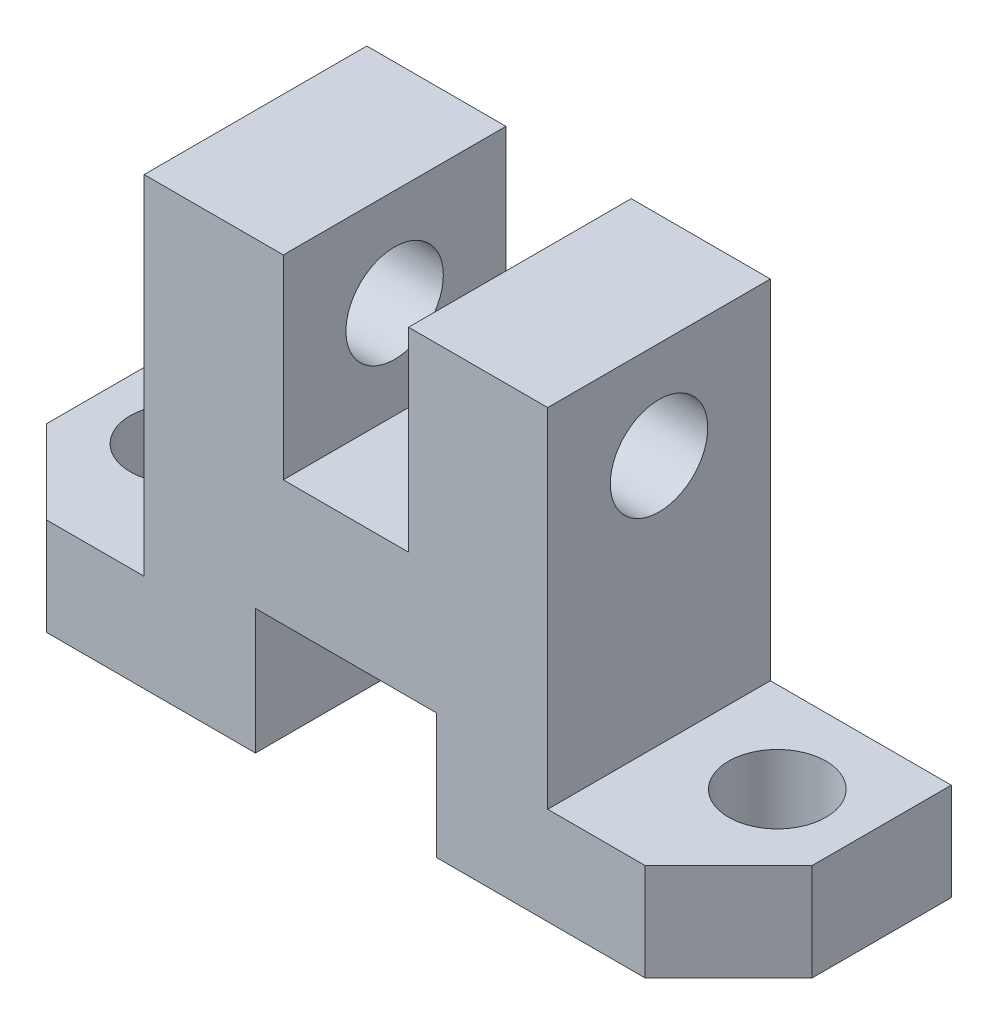
ISO-10303-21;
HEADER;
FILE_DESCRIPTION(('STEP AP214'),'2;1');
FILE_NAME('part.step','',(''),(''),'','','');
FILE_SCHEMA(('AUTOMOTIVE_DESIGN { 1 0 10303 214 1 1 1 1 }'));
ENDSEC;
DATA;
#1=APPLICATION_CONTEXT('core data for automotive mechanical design processes');
#2=APPLICATION_PROTOCOL_DEFINITION('international standard','automotive_design',2000,#1);
#3=PRODUCT_CONTEXT('',#1,'mechanical');
#4=PRODUCT('Part','Part','',(#3));
#5=PRODUCT_RELATED_PRODUCT_CATEGORY('part','',(#4));
#6=PRODUCT_DEFINITION_FORMATION('','',#4);
#7=PRODUCT_DEFINITION_CONTEXT('part definition',#1,'design');
#8=PRODUCT_DEFINITION('design','',#6,#7);
#9=PRODUCT_DEFINITION_SHAPE('','',#8);
#10=(LENGTH_UNIT() NAMED_UNIT(*) SI_UNIT(.MILLI.,.METRE.));
#11=(NAMED_UNIT(*) PLANE_ANGLE_UNIT() SI_UNIT($,.RADIAN.));
#12=(NAMED_UNIT(*) SI_UNIT($,.STERADIAN.) SOLID_ANGLE_UNIT());
#13=UNCERTAINTY_MEASURE_WITH_UNIT(LENGTH_MEASURE(1.E-05),#10,'distance_accuracy_value','');
#14=(GEOMETRIC_REPRESENTATION_CONTEXT(3) GLOBAL_UNCERTAINTY_ASSIGNED_CONTEXT((#13)) GLOBAL_UNIT_ASSIGNED_CONTEXT((#10,
#11,#12)) REPRESENTATION_CONTEXT('',''));
#15=CARTESIAN_POINT('',(0.,0.,0.));
#16=DIRECTION('',(0.,0.,1.));
#17=DIRECTION('',(1.,0.,0.));
#18=AXIS2_PLACEMENT_3D('',#15,#16,#17);
#19=CARTESIAN_POINT('',(-4.5,0.,-16.));
#20=DIRECTION('',(1.,0.,0.));
#21=DIRECTION('',(0.,0.,-1.));
#22=AXIS2_PLACEMENT_3D('',#19,#20,#21);
#23=PLANE('',#22);
#24=CARTESIAN_POINT('',(-4.5,7.,-8.));
#25=DIRECTION('',(1.,0.,0.));
#26=DIRECTION('',(0.,0.,-1.));
#27=AXIS2_PLACEMENT_3D('',#24,#25,#26);
#28=CIRCLE('',#27,3.5);
#29=CARTESIAN_POINT('',(-4.5,7.,-11.5));
#30=VERTEX_POINT('',#29);
#31=EDGE_CURVE('E212',#30,#30,#28,.T.);
#32=ORIENTED_EDGE('',*,*,#31,.F.);
#33=EDGE_LOOP('',(#32));
#34=FACE_BOUND('',#33,.T.);
#35=DIRECTION('',(0.,1.,0.));
#36=VECTOR('',#35,1.);
#37=CARTESIAN_POINT('',(-4.5,0.,0.));
#38=LINE('',#37,#36);
#39=CARTESIAN_POINT('',(-4.5,0.,0.));
#40=VERTEX_POINT('',#39);
#41=CARTESIAN_POINT('',(-4.5,14.,0.));
#42=VERTEX_POINT('',#41);
#43=EDGE_CURVE('E260',#40,#42,#38,.T.);
#44=ORIENTED_EDGE('',*,*,#43,.F.);
#45=DIRECTION('',(0.,0.,1.));
#46=VECTOR('',#45,1.);
#47=CARTESIAN_POINT('',(-4.5,0.,-16.));
#48=LINE('',#47,#46);
#49=CARTESIAN_POINT('',(-4.5,0.,-16.));
#50=VERTEX_POINT('',#49);
#51=EDGE_CURVE('E203',#50,#40,#48,.T.);
#52=ORIENTED_EDGE('',*,*,#51,.F.);
#53=DIRECTION('',(0.,1.,0.));
#54=VECTOR('',#53,1.);
#55=CARTESIAN_POINT('',(-4.5,0.,-16.));
#56=LINE('',#55,#54);
#57=CARTESIAN_POINT('',(-4.5,14.,-16.));
#58=VERTEX_POINT('',#57);
#59=EDGE_CURVE('E196',#50,#58,#56,.T.);
#60=ORIENTED_EDGE('',*,*,#59,.T.);
#61=DIRECTION('',(0.,0.,1.));
#62=VECTOR('',#61,1.);
#63=CARTESIAN_POINT('',(-4.5,14.,-16.));
#64=LINE('',#63,#62);
#65=EDGE_CURVE('E177',#58,#42,#64,.T.);
#66=ORIENTED_EDGE('',*,*,#65,.T.);
#67=EDGE_LOOP('',(#44,#52,#60,#66));
#68=FACE_BOUND('',#67,.T.);
#69=ADVANCED_FACE('F49',(#34,#68),#23,.T.);
#70=CARTESIAN_POINT('',(4.5,0.,-16.));
#71=DIRECTION('',(0.,1.,0.));
#72=DIRECTION('',(-1.,0.,0.));
#73=AXIS2_PLACEMENT_3D('',#70,#71,#72);
#74=PLANE('',#73);
#75=DIRECTION('',(-1.,0.,0.));
#76=VECTOR('',#75,1.);
#77=CARTESIAN_POINT('',(4.5,0.,0.));
#78=LINE('',#77,#76);
#79=CARTESIAN_POINT('',(4.5,0.,0.));
#80=VERTEX_POINT('',#79);
#81=EDGE_CURVE('E205',#80,#40,#78,.T.);
#82=ORIENTED_EDGE('',*,*,#81,.F.);
#83=DIRECTION('',(0.,0.,1.));
#84=VECTOR('',#83,1.);
#85=CARTESIAN_POINT('',(4.5,0.,-16.));
#86=LINE('',#85,#84);
#87=CARTESIAN_POINT('',(4.5,0.,-16.));
#88=VERTEX_POINT('',#87);
#89=EDGE_CURVE('E305',#88,#80,#86,.T.);
#90=ORIENTED_EDGE('',*,*,#89,.F.);
#91=DIRECTION('',(-1.,0.,0.));
#92=VECTOR('',#91,1.);
#93=CARTESIAN_POINT('',(4.5,0.,-16.));
#94=LINE('',#93,#92);
#95=EDGE_CURVE('E189',#88,#50,#94,.T.);
#96=ORIENTED_EDGE('',*,*,#95,.T.);
#97=ORIENTED_EDGE('',*,*,#51,.T.);
#98=EDGE_LOOP('',(#82,#90,#96,#97));
#99=FACE_BOUND('',#98,.T.);
#100=ADVANCED_FACE('F413',(#99),#74,.T.);
#101=CARTESIAN_POINT('',(4.5,0.,-16.));
#102=DIRECTION('',(1.,0.,0.));
#103=DIRECTION('',(0.,1.,0.));
#104=AXIS2_PLACEMENT_3D('',#101,#102,#103);
#105=PLANE('',#104);
#106=CARTESIAN_POINT('',(4.49999999999999,7.,-8.));
#107=DIRECTION('',(1.,0.,0.));
#108=DIRECTION('',(0.,1.,0.));
#109=AXIS2_PLACEMENT_3D('',#106,#107,#108);
#110=CIRCLE('',#109,3.5);
#111=CARTESIAN_POINT('',(4.49999999999999,10.5,-8.));
#112=VERTEX_POINT('',#111);
#113=EDGE_CURVE('E400',#112,#112,#110,.T.);
#114=ORIENTED_EDGE('',*,*,#113,.T.);
#115=EDGE_LOOP('',(#114));
#116=FACE_BOUND('',#115,.T.);
#117=DIRECTION('',(0.,1.,0.));
#118=VECTOR('',#117,1.);
#119=CARTESIAN_POINT('',(4.5,0.,0.));
#120=LINE('',#119,#118);
#121=CARTESIAN_POINT('',(4.49999999999999,14.,0.));
#122=VERTEX_POINT('',#121);
#123=EDGE_CURVE('E209',#80,#122,#120,.T.);
#124=ORIENTED_EDGE('',*,*,#123,.T.);
#125=DIRECTION('',(0.,0.,1.));
#126=VECTOR('',#125,1.);
#127=CARTESIAN_POINT('',(4.49999999999999,14.,-16.));
#128=LINE('',#127,#126);
#129=CARTESIAN_POINT('',(4.49999999999999,14.,-16.));
#130=VERTEX_POINT('',#129);
#131=EDGE_CURVE('E308',#130,#122,#128,.T.);
#132=ORIENTED_EDGE('',*,*,#131,.F.);
#133=DIRECTION('',(0.,1.,0.));
#134=VECTOR('',#133,1.);
#135=CARTESIAN_POINT('',(4.5,0.,-16.));
#136=LINE('',#135,#134);
#137=EDGE_CURVE('E255',#88,#130,#136,.T.);
#138=ORIENTED_EDGE('',*,*,#137,.F.);
#139=ORIENTED_EDGE('',*,*,#89,.T.);
#140=EDGE_LOOP('',(#124,#132,#138,#139));
#141=FACE_BOUND('',#140,.T.);
#142=ADVANCED_FACE('F420',(#116,#141),#105,.F.);
#143=CARTESIAN_POINT('',(4.49999999999999,14.,-16.));
#144=DIRECTION('',(0.,-1.,0.));
#145=DIRECTION('',(0.,0.,-1.));
#146=AXIS2_PLACEMENT_3D('',#143,#144,#145);
#147=PLANE('',#146);
#148=DIRECTION('',(1.,0.,0.));
#149=VECTOR('',#148,1.);
#150=CARTESIAN_POINT('',(4.49999999999999,14.,0.));
#151=LINE('',#150,#149);
#152=CARTESIAN_POINT('',(14.5,14.,0.));
#153=VERTEX_POINT('',#152);
#154=EDGE_CURVE('E297',#122,#153,#151,.T.);
#155=ORIENTED_EDGE('',*,*,#154,.T.);
#156=DIRECTION('',(0.,0.,1.));
#157=VECTOR('',#156,1.);
#158=CARTESIAN_POINT('',(14.5,14.,-16.));
#159=LINE('',#158,#157);
#160=CARTESIAN_POINT('',(14.5,14.,-16.));
#161=VERTEX_POINT('',#160);
#162=EDGE_CURVE('E312',#161,#153,#159,.T.);
#163=ORIENTED_EDGE('',*,*,#162,.F.);
#164=DIRECTION('',(1.,0.,0.));
#165=VECTOR('',#164,1.);
#166=CARTESIAN_POINT('',(4.49999999999999,14.,-16.));
#167=LINE('',#166,#165);
#168=EDGE_CURVE('E252',#130,#161,#167,.T.);
#169=ORIENTED_EDGE('',*,*,#168,.F.);
#170=ORIENTED_EDGE('',*,*,#131,.T.);
#171=EDGE_LOOP('',(#155,#163,#169,#170));
#172=FACE_BOUND('',#171,.T.);
#173=ADVANCED_FACE('F494',(#172),#147,.F.);
#174=CARTESIAN_POINT('',(14.5,14.,-16.));
#175=DIRECTION('',(-1.,0.,0.));
#176=DIRECTION('',(0.,-1.,0.));
#177=AXIS2_PLACEMENT_3D('',#174,#175,#176);
#178=PLANE('',#177);
#179=CARTESIAN_POINT('',(14.5,7.00000000000001,-8.));
#180=DIRECTION('',(-1.,0.,0.));
#181=DIRECTION('',(0.,-1.,0.));
#182=AXIS2_PLACEMENT_3D('',#179,#180,#181);
#183=CIRCLE('',#182,3.5);
#184=CARTESIAN_POINT('',(14.5,3.50000000000001,-8.));
#185=VERTEX_POINT('',#184);
#186=EDGE_CURVE('E358',#185,#185,#183,.T.);
#187=ORIENTED_EDGE('',*,*,#186,.T.);
#188=EDGE_LOOP('',(#187));
#189=FACE_BOUND('',#188,.T.);
#190=DIRECTION('',(0.,-1.,0.));
#191=VECTOR('',#190,1.);
#192=CARTESIAN_POINT('',(14.5,14.,0.));
#193=LINE('',#192,#191);
#194=CARTESIAN_POINT('',(14.5,-11.,0.));
#195=VERTEX_POINT('',#194);
#196=EDGE_CURVE('E294',#153,#195,#193,.T.);
#197=ORIENTED_EDGE('',*,*,#196,.T.);
#198=DIRECTION('',(0.,0.,1.));
#199=VECTOR('',#198,1.);
#200=CARTESIAN_POINT('',(14.5,-11.,-16.));
#201=LINE('',#200,#199);
#202=CARTESIAN_POINT('',(14.5,-11.,-16.));
#203=VERTEX_POINT('',#202);
#204=EDGE_CURVE('E316',#203,#195,#201,.T.);
#205=ORIENTED_EDGE('',*,*,#204,.F.);
#206=DIRECTION('',(0.,-1.,0.));
#207=VECTOR('',#206,1.);
#208=CARTESIAN_POINT('',(14.5,14.,-16.));
#209=LINE('',#208,#207);
#210=EDGE_CURVE('E249',#161,#203,#209,.T.);
#211=ORIENTED_EDGE('',*,*,#210,.F.);
#212=ORIENTED_EDGE('',*,*,#162,.T.);
#213=EDGE_LOOP('',(#197,#205,#211,#212));
#214=FACE_BOUND('',#213,.T.);
#215=ADVANCED_FACE('F490',(#189,#214),#178,.F.);
#216=CARTESIAN_POINT('',(14.5,-11.,-16.));
#217=DIRECTION('',(0.,-1.,0.));
#218=DIRECTION('',(1.,0.,0.));
#219=AXIS2_PLACEMENT_3D('',#216,#217,#218);
#220=PLANE('',#219);
#221=CARTESIAN_POINT('',(21.5,-11.,-9.5));
#222=DIRECTION('',(0.,-1.,0.));
#223=DIRECTION('',(1.,0.,0.));
#224=AXIS2_PLACEMENT_3D('',#221,#222,#223);
#225=CIRCLE('',#224,3.5);
#226=CARTESIAN_POINT('',(25.,-11.,-9.5));
#227=VERTEX_POINT('',#226);
#228=EDGE_CURVE('E389',#227,#227,#225,.T.);
#229=ORIENTED_EDGE('',*,*,#228,.T.);
#230=EDGE_LOOP('',(#229));
#231=FACE_BOUND('',#230,.T.);
#232=DIRECTION('',(1.,0.,0.));
#233=VECTOR('',#232,1.);
#234=CARTESIAN_POINT('',(14.5,-11.,0.));
#235=LINE('',#234,#233);
#236=CARTESIAN_POINT('',(21.5,-11.,0.));
#237=VERTEX_POINT('',#236);
#238=EDGE_CURVE('E291',#195,#237,#235,.T.);
#239=ORIENTED_EDGE('',*,*,#238,.T.);
#240=DIRECTION('',(0.707106781186549,0.,-0.707106781186546));
#241=VECTOR('',#240,1.);
#242=CARTESIAN_POINT('',(27.5,-11.,-6.00000000000001));
#243=LINE('',#242,#241);
#244=CARTESIAN_POINT('',(27.5,-11.,-6.00000000000001));
#245=VERTEX_POINT('',#244);
#246=EDGE_CURVE('E11',#237,#245,#243,.T.);
#247=ORIENTED_EDGE('',*,*,#246,.T.);
#248=DIRECTION('',(0.,0.,1.));
#249=VECTOR('',#248,1.);
#250=CARTESIAN_POINT('',(27.5,-11.,-16.));
#251=LINE('',#250,#249);
#252=CARTESIAN_POINT('',(27.5,-11.,-16.));
#253=VERTEX_POINT('',#252);
#254=EDGE_CURVE('E320',#253,#245,#251,.T.);
#255=ORIENTED_EDGE('',*,*,#254,.F.);
#256=DIRECTION('',(1.,0.,0.));
#257=VECTOR('',#256,1.);
#258=CARTESIAN_POINT('',(14.5,-11.,-16.));
#259=LINE('',#258,#257);
#260=EDGE_CURVE('E246',#203,#253,#259,.T.);
#261=ORIENTED_EDGE('',*,*,#260,.F.);
#262=ORIENTED_EDGE('',*,*,#204,.T.);
#263=EDGE_LOOP('',(#239,#247,#255,#261,#262));
#264=FACE_BOUND('',#263,.T.);
#265=ADVANCED_FACE('F477',(#231,#264),#220,.F.);
#266=CARTESIAN_POINT('',(27.5,-11.,-16.));
#267=DIRECTION('',(-1.,0.,0.));
#268=DIRECTION('',(0.,-1.,0.));
#269=AXIS2_PLACEMENT_3D('',#266,#267,#268);
#270=PLANE('',#269);
#271=ORIENTED_EDGE('',*,*,#254,.T.);
#272=DIRECTION('',(0.,-1.,0.));
#273=VECTOR('',#272,1.);
#274=CARTESIAN_POINT('',(27.5,-18.,-6.00000000000001));
#275=LINE('',#274,#273);
#276=CARTESIAN_POINT('',(27.5,-18.,-6.00000000000001));
#277=VERTEX_POINT('',#276);
#278=EDGE_CURVE('E372',#245,#277,#275,.T.);
#279=ORIENTED_EDGE('',*,*,#278,.T.);
#280=DIRECTION('',(0.,0.,1.));
#281=VECTOR('',#280,1.);
#282=CARTESIAN_POINT('',(27.5,-18.,-16.));
#283=LINE('',#282,#281);
#284=CARTESIAN_POINT('',(27.5,-18.,-16.));
#285=VERTEX_POINT('',#284);
#286=EDGE_CURVE('E324',#285,#277,#283,.T.);
#287=ORIENTED_EDGE('',*,*,#286,.F.);
#288=DIRECTION('',(0.,-1.,0.));
#289=VECTOR('',#288,1.);
#290=CARTESIAN_POINT('',(27.5,-11.,-16.));
#291=LINE('',#290,#289);
#292=EDGE_CURVE('E243',#253,#285,#291,.T.);
#293=ORIENTED_EDGE('',*,*,#292,.F.);
#294=EDGE_LOOP('',(#271,#279,#287,#293));
#295=FACE_BOUND('',#294,.T.);
#296=ADVANCED_FACE('F481',(#295),#270,.F.);
#297=CARTESIAN_POINT('',(27.5,-18.,-16.));
#298=DIRECTION('',(0.,1.,0.));
#299=DIRECTION('',(-1.,0.,0.));
#300=AXIS2_PLACEMENT_3D('',#297,#298,#299);
#301=PLANE('',#300);
#302=CARTESIAN_POINT('',(21.5,-18.,-9.5));
#303=DIRECTION('',(0.,1.,0.));
#304=DIRECTION('',(-1.,0.,0.));
#305=AXIS2_PLACEMENT_3D('',#302,#303,#304);
#306=CIRCLE('',#305,3.5);
#307=CARTESIAN_POINT('',(18.,-18.,-9.5));
#308=VERTEX_POINT('',#307);
#309=EDGE_CURVE('E54',#308,#308,#306,.F.);
#310=ORIENTED_EDGE('',*,*,#309,.F.);
#311=EDGE_LOOP('',(#310));
#312=FACE_BOUND('',#311,.T.);
#313=ORIENTED_EDGE('',*,*,#286,.T.);
#314=DIRECTION('',(-0.707106781186549,0.,0.707106781186546));
#315=VECTOR('',#314,1.);
#316=CARTESIAN_POINT('',(27.5,-18.,-6.));
#317=LINE('',#316,#315);
#318=CARTESIAN_POINT('',(21.5,-18.,0.));
#319=VERTEX_POINT('',#318);
#320=EDGE_CURVE('E75',#277,#319,#317,.T.);
#321=ORIENTED_EDGE('',*,*,#320,.T.);
#322=DIRECTION('',(-1.,0.,0.));
#323=VECTOR('',#322,1.);
#324=CARTESIAN_POINT('',(27.5,-18.,0.));
#325=LINE('',#324,#323);
#326=CARTESIAN_POINT('',(6.50000000000001,-18.,0.));
#327=VERTEX_POINT('',#326);
#328=EDGE_CURVE('E288',#319,#327,#325,.T.);
#329=ORIENTED_EDGE('',*,*,#328,.T.);
#330=DIRECTION('',(0.,0.,1.));
#331=VECTOR('',#330,1.);
#332=CARTESIAN_POINT('',(6.50000000000001,-18.,-16.));
#333=LINE('',#332,#331);
#334=CARTESIAN_POINT('',(6.50000000000001,-18.,-16.));
#335=VERTEX_POINT('',#334);
#336=EDGE_CURVE('E327',#335,#327,#333,.T.);
#337=ORIENTED_EDGE('',*,*,#336,.F.);
#338=DIRECTION('',(-1.,0.,0.));
#339=VECTOR('',#338,1.);
#340=CARTESIAN_POINT('',(27.5,-18.,-16.));
#341=LINE('',#340,#339);
#342=EDGE_CURVE('E240',#285,#335,#341,.T.);
#343=ORIENTED_EDGE('',*,*,#342,.F.);
#344=EDGE_LOOP('',(#313,#321,#329,#337,#343));
#345=FACE_BOUND('',#344,.T.);
#346=ADVANCED_FACE('F512',(#312,#345),#301,.F.);
#347=CARTESIAN_POINT('',(6.50000000000001,-18.,-16.));
#348=DIRECTION('',(1.,0.,0.));
#349=DIRECTION('',(0.,1.,0.));
#350=AXIS2_PLACEMENT_3D('',#347,#348,#349);
#351=PLANE('',#350);
#352=DIRECTION('',(0.,1.,0.));
#353=VECTOR('',#352,1.);
#354=CARTESIAN_POINT('',(6.50000000000001,-18.,0.));
#355=LINE('',#354,#353);
#356=CARTESIAN_POINT('',(6.5,-9.00000000000001,0.));
#357=VERTEX_POINT('',#356);
#358=EDGE_CURVE('E284',#327,#357,#355,.T.);
#359=ORIENTED_EDGE('',*,*,#358,.T.);
#360=DIRECTION('',(0.,0.,1.));
#361=VECTOR('',#360,1.);
#362=CARTESIAN_POINT('',(6.5,-9.00000000000001,-16.));
#363=LINE('',#362,#361);
#364=CARTESIAN_POINT('',(6.5,-9.00000000000001,-16.));
#365=VERTEX_POINT('',#364);
#366=EDGE_CURVE('E331',#365,#357,#363,.T.);
#367=ORIENTED_EDGE('',*,*,#366,.F.);
#368=DIRECTION('',(0.,1.,0.));
#369=VECTOR('',#368,1.);
#370=CARTESIAN_POINT('',(6.50000000000001,-18.,-16.));
#371=LINE('',#370,#369);
#372=EDGE_CURVE('E237',#335,#365,#371,.T.);
#373=ORIENTED_EDGE('',*,*,#372,.F.);
#374=ORIENTED_EDGE('',*,*,#336,.T.);
#375=EDGE_LOOP('',(#359,#367,#373,#374));
#376=FACE_BOUND('',#375,.T.);
#377=ADVANCED_FACE('F471',(#376),#351,.F.);
#378=CARTESIAN_POINT('',(-6.5,-9.00000000000001,-16.));
#379=DIRECTION('',(0.,-1.,0.));
#380=DIRECTION('',(0.,0.,-1.));
#381=AXIS2_PLACEMENT_3D('',#378,#379,#380);
#382=PLANE('',#381);
#383=DIRECTION('',(1.,0.,0.));
#384=VECTOR('',#383,1.);
#385=CARTESIAN_POINT('',(-6.5,-9.00000000000001,0.));
#386=LINE('',#385,#384);
#387=CARTESIAN_POINT('',(-6.5,-9.00000000000001,0.));
#388=VERTEX_POINT('',#387);
#389=EDGE_CURVE('E280',#388,#357,#386,.T.);
#390=ORIENTED_EDGE('',*,*,#389,.F.);
#391=DIRECTION('',(0.,0.,1.));
#392=VECTOR('',#391,1.);
#393=CARTESIAN_POINT('',(-6.5,-9.00000000000001,-16.));
#394=LINE('',#393,#392);
#395=CARTESIAN_POINT('',(-6.5,-9.00000000000001,-16.));
#396=VERTEX_POINT('',#395);
#397=EDGE_CURVE('E334',#396,#388,#394,.T.);
#398=ORIENTED_EDGE('',*,*,#397,.F.);
#399=DIRECTION('',(1.,0.,0.));
#400=VECTOR('',#399,1.);
#401=CARTESIAN_POINT('',(-6.5,-9.00000000000001,-16.));
#402=LINE('',#401,#400);
#403=EDGE_CURVE('E233',#396,#365,#402,.T.);
#404=ORIENTED_EDGE('',*,*,#403,.T.);
#405=ORIENTED_EDGE('',*,*,#366,.T.);
#406=EDGE_LOOP('',(#390,#398,#404,#405));
#407=FACE_BOUND('',#406,.T.);
#408=ADVANCED_FACE('F467',(#407),#382,.T.);
#409=CARTESIAN_POINT('',(-6.5,-18.,-16.));
#410=DIRECTION('',(1.,0.,0.));
#411=DIRECTION('',(0.,0.,-1.));
#412=AXIS2_PLACEMENT_3D('',#409,#410,#411);
#413=PLANE('',#412);
#414=DIRECTION('',(0.,1.,0.));
#415=VECTOR('',#414,1.);
#416=CARTESIAN_POINT('',(-6.5,-18.,0.));
#417=LINE('',#416,#415);
#418=CARTESIAN_POINT('',(-6.5,-18.,0.));
#419=VERTEX_POINT('',#418);
#420=EDGE_CURVE('E276',#419,#388,#417,.T.);
#421=ORIENTED_EDGE('',*,*,#420,.F.);
#422=DIRECTION('',(0.,0.,1.));
#423=VECTOR('',#422,1.);
#424=CARTESIAN_POINT('',(-6.5,-18.,-16.));
#425=LINE('',#424,#423);
#426=CARTESIAN_POINT('',(-6.5,-18.,-16.));
#427=VERTEX_POINT('',#426);
#428=EDGE_CURVE('E337',#427,#419,#425,.T.);
#429=ORIENTED_EDGE('',*,*,#428,.F.);
#430=DIRECTION('',(0.,1.,0.));
#431=VECTOR('',#430,1.);
#432=CARTESIAN_POINT('',(-6.5,-18.,-16.));
#433=LINE('',#432,#431);
#434=EDGE_CURVE('E229',#427,#396,#433,.T.);
#435=ORIENTED_EDGE('',*,*,#434,.T.);
#436=ORIENTED_EDGE('',*,*,#397,.T.);
#437=EDGE_LOOP('',(#421,#429,#435,#436));
#438=FACE_BOUND('',#437,.T.);
#439=ADVANCED_FACE('F464',(#438),#413,.T.);
#440=CARTESIAN_POINT('',(-27.5,-18.,-16.));
#441=DIRECTION('',(0.,-1.,0.));
#442=DIRECTION('',(0.,0.,-1.));
#443=AXIS2_PLACEMENT_3D('',#440,#441,#442);
#444=PLANE('',#443);
#445=CARTESIAN_POINT('',(-21.5,-18.,-9.5));
#446=DIRECTION('',(0.,-1.,0.));
#447=DIRECTION('',(0.,0.,-1.));
#448=AXIS2_PLACEMENT_3D('',#445,#446,#447);
#449=CIRCLE('',#448,3.5);
#450=CARTESIAN_POINT('',(-21.5,-18.,-13.));
#451=VERTEX_POINT('',#450);
#452=EDGE_CURVE('E359',#451,#451,#449,.F.);
#453=ORIENTED_EDGE('',*,*,#452,.T.);
#454=EDGE_LOOP('',(#453));
#455=FACE_BOUND('',#454,.T.);
#456=DIRECTION('',(1.,0.,0.));
#457=VECTOR('',#456,1.);
#458=CARTESIAN_POINT('',(-27.5,-18.,0.));
#459=LINE('',#458,#457);
#460=CARTESIAN_POINT('',(-21.5,-18.,0.));
#461=VERTEX_POINT('',#460);
#462=EDGE_CURVE('E273',#461,#419,#459,.T.);
#463=ORIENTED_EDGE('',*,*,#462,.F.);
#464=DIRECTION('',(0.707106781186546,0.,0.707106781186549));
#465=VECTOR('',#464,1.);
#466=CARTESIAN_POINT('',(-32.5,-18.,-11.));
#467=LINE('',#466,#465);
#468=CARTESIAN_POINT('',(-27.5,-18.,-6.00000000000003));
#469=VERTEX_POINT('',#468);
#470=EDGE_CURVE('E363',#461,#469,#467,.F.);
#471=ORIENTED_EDGE('',*,*,#470,.T.);
#472=DIRECTION('',(0.,0.,1.));
#473=VECTOR('',#472,1.);
#474=CARTESIAN_POINT('',(-27.5,-18.,-16.));
#475=LINE('',#474,#473);
#476=CARTESIAN_POINT('',(-27.5,-18.,-16.));
#477=VERTEX_POINT('',#476);
#478=EDGE_CURVE('E341',#477,#469,#475,.T.);
#479=ORIENTED_EDGE('',*,*,#478,.F.);
#480=DIRECTION('',(1.,0.,0.));
#481=VECTOR('',#480,1.);
#482=CARTESIAN_POINT('',(-27.5,-18.,-16.));
#483=LINE('',#482,#481);
#484=EDGE_CURVE('E225',#477,#427,#483,.T.);
#485=ORIENTED_EDGE('',*,*,#484,.T.);
#486=ORIENTED_EDGE('',*,*,#428,.T.);
#487=EDGE_LOOP('',(#463,#471,#479,#485,#486));
#488=FACE_BOUND('',#487,.T.);
#489=ADVANCED_FACE('F459',(#455,#488),#444,.T.);
#490=CARTESIAN_POINT('',(-27.5,-11.,-16.));
#491=DIRECTION('',(-1.,0.,0.));
#492=DIRECTION('',(0.,-1.,0.));
#493=AXIS2_PLACEMENT_3D('',#490,#491,#492);
#494=PLANE('',#493);
#495=ORIENTED_EDGE('',*,*,#478,.T.);
#496=DIRECTION('',(0.,1.,0.));
#497=VECTOR('',#496,1.);
#498=CARTESIAN_POINT('',(-27.5,-11.,-6.00000000000003));
#499=LINE('',#498,#497);
#500=CARTESIAN_POINT('',(-27.5,-11.,-6.00000000000003));
#501=VERTEX_POINT('',#500);
#502=EDGE_CURVE('E366',#469,#501,#499,.T.);
#503=ORIENTED_EDGE('',*,*,#502,.T.);
#504=DIRECTION('',(0.,0.,1.));
#505=VECTOR('',#504,1.);
#506=CARTESIAN_POINT('',(-27.5,-11.,-16.));
#507=LINE('',#506,#505);
#508=CARTESIAN_POINT('',(-27.5,-11.,-16.));
#509=VERTEX_POINT('',#508);
#510=EDGE_CURVE('E345',#509,#501,#507,.T.);
#511=ORIENTED_EDGE('',*,*,#510,.F.);
#512=DIRECTION('',(0.,-1.,0.));
#513=VECTOR('',#512,1.);
#514=CARTESIAN_POINT('',(-27.5,-11.,-16.));
#515=LINE('',#514,#513);
#516=EDGE_CURVE('E221',#509,#477,#515,.T.);
#517=ORIENTED_EDGE('',*,*,#516,.T.);
#518=EDGE_LOOP('',(#495,#503,#511,#517));
#519=FACE_BOUND('',#518,.T.);
#520=ADVANCED_FACE('F457',(#519),#494,.T.);
#521=CARTESIAN_POINT('',(-14.5,-11.,-16.));
#522=DIRECTION('',(0.,1.,0.));
#523=DIRECTION('',(-1.,0.,0.));
#524=AXIS2_PLACEMENT_3D('',#521,#522,#523);
#525=PLANE('',#524);
#526=CARTESIAN_POINT('',(-21.5,-11.,-9.5));
#527=DIRECTION('',(0.,1.,0.));
#528=DIRECTION('',(-1.,0.,0.));
#529=AXIS2_PLACEMENT_3D('',#526,#527,#528);
#530=CIRCLE('',#529,3.5);
#531=CARTESIAN_POINT('',(-25.,-11.,-9.5));
#532=VERTEX_POINT('',#531);
#533=EDGE_CURVE('E379',#532,#532,#530,.F.);
#534=ORIENTED_EDGE('',*,*,#533,.T.);
#535=EDGE_LOOP('',(#534));
#536=FACE_BOUND('',#535,.T.);
#537=ORIENTED_EDGE('',*,*,#510,.T.);
#538=DIRECTION('',(-0.707106781186546,0.,-0.707106781186549));
#539=VECTOR('',#538,1.);
#540=CARTESIAN_POINT('',(-26.,-11.,-4.50000000000004));
#541=LINE('',#540,#539);
#542=CARTESIAN_POINT('',(-21.5,-11.,0.));
#543=VERTEX_POINT('',#542);
#544=EDGE_CURVE('E369',#501,#543,#541,.F.);
#545=ORIENTED_EDGE('',*,*,#544,.T.);
#546=DIRECTION('',(-1.,0.,0.));
#547=VECTOR('',#546,1.);
#548=CARTESIAN_POINT('',(-14.5,-11.,0.));
#549=LINE('',#548,#547);
#550=CARTESIAN_POINT('',(-14.5,-11.,0.));
#551=VERTEX_POINT('',#550);
#552=EDGE_CURVE('E269',#551,#543,#549,.T.);
#553=ORIENTED_EDGE('',*,*,#552,.F.);
#554=DIRECTION('',(0.,0.,1.));
#555=VECTOR('',#554,1.);
#556=CARTESIAN_POINT('',(-14.5,-11.,-16.));
#557=LINE('',#556,#555);
#558=CARTESIAN_POINT('',(-14.5,-11.,-16.));
#559=VERTEX_POINT('',#558);
#560=EDGE_CURVE('E349',#559,#551,#557,.T.);
#561=ORIENTED_EDGE('',*,*,#560,.F.);
#562=DIRECTION('',(-1.,0.,0.));
#563=VECTOR('',#562,1.);
#564=CARTESIAN_POINT('',(-14.5,-11.,-16.));
#565=LINE('',#564,#563);
#566=EDGE_CURVE('E217',#559,#509,#565,.T.);
#567=ORIENTED_EDGE('',*,*,#566,.T.);
#568=EDGE_LOOP('',(#537,#545,#553,#561,#567));
#569=FACE_BOUND('',#568,.T.);
#570=ADVANCED_FACE('F447',(#536,#569),#525,.T.);
#571=CARTESIAN_POINT('',(-14.5,14.,-16.));
#572=DIRECTION('',(-1.,0.,0.));
#573=DIRECTION('',(0.,-1.,0.));
#574=AXIS2_PLACEMENT_3D('',#571,#572,#573);
#575=PLANE('',#574);
#576=CARTESIAN_POINT('',(-14.5,6.99999999999999,-8.));
#577=DIRECTION('',(-1.,0.,0.));
#578=DIRECTION('',(0.,-1.,0.));
#579=AXIS2_PLACEMENT_3D('',#576,#577,#578);
#580=CIRCLE('',#579,3.5);
#581=CARTESIAN_POINT('',(-14.5,3.49999999999999,-8.));
#582=VERTEX_POINT('',#581);
#583=EDGE_CURVE('E354',#582,#582,#580,.T.);
#584=ORIENTED_EDGE('',*,*,#583,.F.);
#585=EDGE_LOOP('',(#584));
#586=FACE_BOUND('',#585,.T.);
#587=DIRECTION('',(0.,-1.,0.));
#588=VECTOR('',#587,1.);
#589=CARTESIAN_POINT('',(-14.5,14.,0.));
#590=LINE('',#589,#588);
#591=CARTESIAN_POINT('',(-14.5,14.,0.));
#592=VERTEX_POINT('',#591);
#593=EDGE_CURVE('E265',#592,#551,#590,.T.);
#594=ORIENTED_EDGE('',*,*,#593,.F.);
#595=DIRECTION('',(0.,0.,1.));
#596=VECTOR('',#595,1.);
#597=CARTESIAN_POINT('',(-14.5,14.,-16.));
#598=LINE('',#597,#596);
#599=CARTESIAN_POINT('',(-14.5,14.,-16.));
#600=VERTEX_POINT('',#599);
#601=EDGE_CURVE('E188',#600,#592,#598,.T.);
#602=ORIENTED_EDGE('',*,*,#601,.F.);
#603=DIRECTION('',(0.,-1.,0.));
#604=VECTOR('',#603,1.);
#605=CARTESIAN_POINT('',(-14.5,14.,-16.));
#606=LINE('',#605,#604);
#607=EDGE_CURVE('E200',#600,#559,#606,.T.);
#608=ORIENTED_EDGE('',*,*,#607,.T.);
#609=ORIENTED_EDGE('',*,*,#560,.T.);
#610=EDGE_LOOP('',(#594,#602,#608,#609));
#611=FACE_BOUND('',#610,.T.);
#612=ADVANCED_FACE('F452',(#586,#611),#575,.T.);
#613=CARTESIAN_POINT('',(-4.5,14.,-16.));
#614=DIRECTION('',(0.,1.,0.));
#615=DIRECTION('',(-1.,0.,0.));
#616=AXIS2_PLACEMENT_3D('',#613,#614,#615);
#617=PLANE('',#616);
#618=DIRECTION('',(-1.,0.,0.));
#619=VECTOR('',#618,1.);
#620=CARTESIAN_POINT('',(-4.5,14.,0.));
#621=LINE('',#620,#619);
#622=EDGE_CURVE('E182',#42,#592,#621,.T.);
#623=ORIENTED_EDGE('',*,*,#622,.F.);
#624=ORIENTED_EDGE('',*,*,#65,.F.);
#625=DIRECTION('',(-1.,0.,0.));
#626=VECTOR('',#625,1.);
#627=CARTESIAN_POINT('',(-4.5,14.,-16.));
#628=LINE('',#627,#626);
#629=EDGE_CURVE('E180',#58,#600,#628,.T.);
#630=ORIENTED_EDGE('',*,*,#629,.T.);
#631=ORIENTED_EDGE('',*,*,#601,.T.);
#632=EDGE_LOOP('',(#623,#624,#630,#631));
#633=FACE_BOUND('',#632,.T.);
#634=ADVANCED_FACE('F179',(#633),#617,.T.);
#635=CARTESIAN_POINT('',(0.,0.,-16.));
#636=DIRECTION('',(0.,0.,1.));
#637=DIRECTION('',(1.,0.,0.));
#638=AXIS2_PLACEMENT_3D('',#635,#636,#637);
#639=PLANE('',#638);
#640=ORIENTED_EDGE('',*,*,#59,.F.);
#641=ORIENTED_EDGE('',*,*,#95,.F.);
#642=ORIENTED_EDGE('',*,*,#137,.T.);
#643=ORIENTED_EDGE('',*,*,#168,.T.);
#644=ORIENTED_EDGE('',*,*,#210,.T.);
#645=ORIENTED_EDGE('',*,*,#260,.T.);
#646=ORIENTED_EDGE('',*,*,#292,.T.);
#647=ORIENTED_EDGE('',*,*,#342,.T.);
#648=ORIENTED_EDGE('',*,*,#372,.T.);
#649=ORIENTED_EDGE('',*,*,#403,.F.);
#650=ORIENTED_EDGE('',*,*,#434,.F.);
#651=ORIENTED_EDGE('',*,*,#484,.F.);
#652=ORIENTED_EDGE('',*,*,#516,.F.);
#653=ORIENTED_EDGE('',*,*,#566,.F.);
#654=ORIENTED_EDGE('',*,*,#607,.F.);
#655=ORIENTED_EDGE('',*,*,#629,.F.);
#656=EDGE_LOOP('',(#640,#641,#642,#643,#644,#645,#646,#647,#648,#649,#650,#651,#652,#653,#654,#655));
#657=FACE_BOUND('',#656,.T.);
#658=ADVANCED_FACE('F194',(#657),#639,.F.);
#659=CARTESIAN_POINT('',(0.,0.,0.));
#660=DIRECTION('',(0.,0.,1.));
#661=DIRECTION('',(1.,0.,0.));
#662=AXIS2_PLACEMENT_3D('',#659,#660,#661);
#663=PLANE('',#662);
#664=ORIENTED_EDGE('',*,*,#328,.F.);
#665=DIRECTION('',(0.,1.,0.));
#666=VECTOR('',#665,1.);
#667=CARTESIAN_POINT('',(21.5,-11.,0.));
#668=LINE('',#667,#666);
#669=EDGE_CURVE('E60',#319,#237,#668,.T.);
#670=ORIENTED_EDGE('',*,*,#669,.T.);
#671=ORIENTED_EDGE('',*,*,#238,.F.);
#672=ORIENTED_EDGE('',*,*,#196,.F.);
#673=ORIENTED_EDGE('',*,*,#154,.F.);
#674=ORIENTED_EDGE('',*,*,#123,.F.);
#675=ORIENTED_EDGE('',*,*,#81,.T.);
#676=ORIENTED_EDGE('',*,*,#43,.T.);
#677=ORIENTED_EDGE('',*,*,#622,.T.);
#678=ORIENTED_EDGE('',*,*,#593,.T.);
#679=ORIENTED_EDGE('',*,*,#552,.T.);
#680=DIRECTION('',(0.,-1.,0.));
#681=VECTOR('',#680,1.);
#682=CARTESIAN_POINT('',(-21.5,0.,0.));
#683=LINE('',#682,#681);
#684=EDGE_CURVE('E304',#543,#461,#683,.T.);
#685=ORIENTED_EDGE('',*,*,#684,.T.);
#686=ORIENTED_EDGE('',*,*,#462,.T.);
#687=ORIENTED_EDGE('',*,*,#420,.T.);
#688=ORIENTED_EDGE('',*,*,#389,.T.);
#689=ORIENTED_EDGE('',*,*,#358,.F.);
#690=EDGE_LOOP('',(#664,#670,#671,#672,#673,#674,#675,#676,#677,#678,#679,#685,#686,#687,#688,#689));
#691=FACE_BOUND('',#690,.T.);
#692=ADVANCED_FACE('F448',(#691),#663,.T.);
#693=CARTESIAN_POINT('',(-27.5,6.99999999999999,-8.));
#694=DIRECTION('',(1.,0.,0.));
#695=DIRECTION('',(0.,1.,0.));
#696=AXIS2_PLACEMENT_3D('',#693,#694,#695);
#697=CYLINDRICAL_SURFACE('',#696,3.5);
#698=ORIENTED_EDGE('',*,*,#31,.T.);
#699=EDGE_LOOP('',(#698));
#700=FACE_BOUND('',#699,.T.);
#701=ORIENTED_EDGE('',*,*,#583,.T.);
#702=EDGE_LOOP('',(#701));
#703=FACE_BOUND('',#702,.T.);
#704=ADVANCED_FACE('F409',(#700,#703),#697,.F.);
#705=ORIENTED_EDGE('',*,*,#186,.F.);
#706=EDGE_LOOP('',(#705));
#707=FACE_BOUND('',#706,.T.);
#708=ORIENTED_EDGE('',*,*,#113,.F.);
#709=EDGE_LOOP('',(#708));
#710=FACE_BOUND('',#709,.T.);
#711=ADVANCED_FACE('F430',(#707,#710),#697,.F.);
#712=CARTESIAN_POINT('',(-21.5,0.,0.));
#713=DIRECTION('',(0.707106781186549,0.,-0.707106781186546));
#714=DIRECTION('',(0.,-1.,0.));
#715=AXIS2_PLACEMENT_3D('',#712,#713,#714);
#716=PLANE('',#715);
#717=ORIENTED_EDGE('',*,*,#544,.F.);
#718=ORIENTED_EDGE('',*,*,#502,.F.);
#719=ORIENTED_EDGE('',*,*,#470,.F.);
#720=ORIENTED_EDGE('',*,*,#684,.F.);
#721=EDGE_LOOP('',(#717,#718,#719,#720));
#722=FACE_BOUND('',#721,.T.);
#723=ADVANCED_FACE('F426',(#722),#716,.F.);
#724=CARTESIAN_POINT('',(27.5,-11.,-6.00000000000001));
#725=DIRECTION('',(0.707106781186546,0.,0.707106781186549));
#726=DIRECTION('',(0.,1.,0.));
#727=AXIS2_PLACEMENT_3D('',#724,#725,#726);
#728=PLANE('',#727);
#729=ORIENTED_EDGE('',*,*,#246,.F.);
#730=ORIENTED_EDGE('',*,*,#669,.F.);
#731=ORIENTED_EDGE('',*,*,#320,.F.);
#732=ORIENTED_EDGE('',*,*,#278,.F.);
#733=EDGE_LOOP('',(#729,#730,#731,#732));
#734=FACE_BOUND('',#733,.T.);
#735=ADVANCED_FACE('F52',(#734),#728,.T.);
#736=CARTESIAN_POINT('',(-21.5,14.,-9.5));
#737=DIRECTION('',(0.,-1.,0.));
#738=DIRECTION('',(1.,0.,0.));
#739=AXIS2_PLACEMENT_3D('',#736,#737,#738);
#740=CYLINDRICAL_SURFACE('',#739,3.5);
#741=ORIENTED_EDGE('',*,*,#452,.F.);
#742=EDGE_LOOP('',(#741));
#743=FACE_BOUND('',#742,.T.);
#744=ORIENTED_EDGE('',*,*,#533,.F.);
#745=EDGE_LOOP('',(#744));
#746=FACE_BOUND('',#745,.T.);
#747=ADVANCED_FACE('F437',(#743,#746),#740,.F.);
#748=CARTESIAN_POINT('',(21.5,-27.,-9.5));
#749=DIRECTION('',(0.,1.,0.));
#750=DIRECTION('',(-1.,0.,0.));
#751=AXIS2_PLACEMENT_3D('',#748,#749,#750);
#752=CYLINDRICAL_SURFACE('',#751,3.5);
#753=ORIENTED_EDGE('',*,*,#228,.F.);
#754=EDGE_LOOP('',(#753));
#755=FACE_BOUND('',#754,.T.);
#756=ORIENTED_EDGE('',*,*,#309,.T.);
#757=EDGE_LOOP('',(#756));
#758=FACE_BOUND('',#757,.T.);
#759=ADVANCED_FACE('F656',(#755,#758),#752,.F.);
#760=CLOSED_SHELL('',(#69,#100,#142,#173,#215,#265,#296,#346,#377,#408,#439,#489,#520,#570,#612,
#634,#658,#692,#704,#711,#723,#735,#747,#759));
#761=MANIFOLD_SOLID_BREP('B2',#760);
#762=ADVANCED_BREP_SHAPE_REPRESENTATION('',(#18,#761),#14);
#763=SHAPE_DEFINITION_REPRESENTATION(#9,#762);
ENDSEC;
END-ISO-10303-21;
